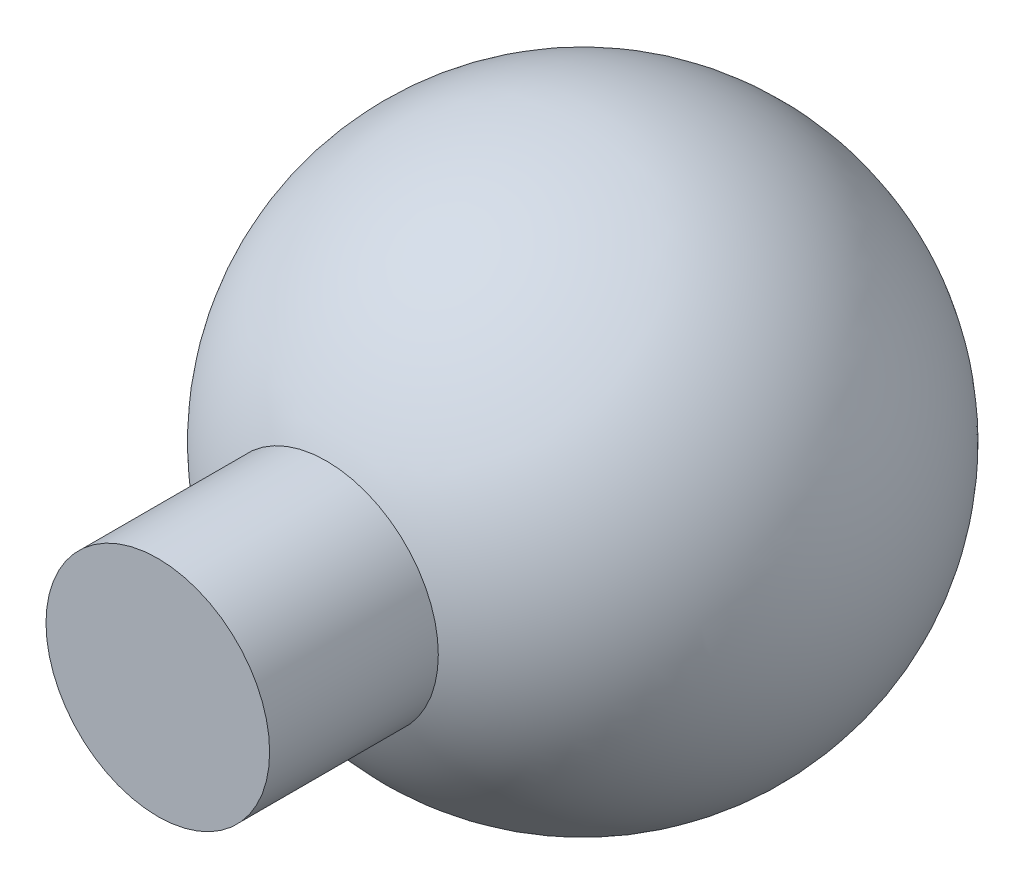
ISO-10303-21;
HEADER;
FILE_DESCRIPTION(('STEP AP214'),'2;1');
FILE_NAME('part.step','',(''),(''),'','','');
FILE_SCHEMA(('AUTOMOTIVE_DESIGN { 1 0 10303 214 1 1 1 1 }'));
ENDSEC;
DATA;
#1=APPLICATION_CONTEXT('core data for automotive mechanical design processes');
#2=APPLICATION_PROTOCOL_DEFINITION('international standard','automotive_design',2000,#1);
#3=PRODUCT_CONTEXT('',#1,'mechanical');
#4=PRODUCT('Part','Part','',(#3));
#5=PRODUCT_RELATED_PRODUCT_CATEGORY('part','',(#4));
#6=PRODUCT_DEFINITION_FORMATION('','',#4);
#7=PRODUCT_DEFINITION_CONTEXT('part definition',#1,'design');
#8=PRODUCT_DEFINITION('design','',#6,#7);
#9=PRODUCT_DEFINITION_SHAPE('','',#8);
#10=(LENGTH_UNIT() NAMED_UNIT(*) SI_UNIT(.MILLI.,.METRE.));
#11=(NAMED_UNIT(*) PLANE_ANGLE_UNIT() SI_UNIT($,.RADIAN.));
#12=(NAMED_UNIT(*) SI_UNIT($,.STERADIAN.) SOLID_ANGLE_UNIT());
#13=UNCERTAINTY_MEASURE_WITH_UNIT(LENGTH_MEASURE(1.E-05),#10,'distance_accuracy_value','');
#14=(GEOMETRIC_REPRESENTATION_CONTEXT(3) GLOBAL_UNCERTAINTY_ASSIGNED_CONTEXT((#13)) GLOBAL_UNIT_ASSIGNED_CONTEXT((#10,
#11,#12)) REPRESENTATION_CONTEXT('',''));
#15=CARTESIAN_POINT('',(0.,0.,0.));
#16=DIRECTION('',(0.,0.,1.));
#17=DIRECTION('',(1.,0.,0.));
#18=AXIS2_PLACEMENT_3D('',#15,#16,#17);
#19=CARTESIAN_POINT('',(0.,0.,0.));
#20=DIRECTION('',(0.,0.,1.));
#21=DIRECTION('',(1.,0.,0.));
#22=AXIS2_PLACEMENT_3D('',#19,#20,#21);
#23=PLANE('',#22);
#24=CARTESIAN_POINT('',(0.,0.,0.));
#25=DIRECTION('',(0.,0.,1.));
#26=DIRECTION('',(1.,0.,0.));
#27=AXIS2_PLACEMENT_3D('',#24,#25,#26);
#28=CIRCLE('',#27,10.);
#29=CARTESIAN_POINT('',(10.,0.,0.));
#30=VERTEX_POINT('',#29);
#31=EDGE_CURVE('E10',#30,#30,#28,.T.);
#32=ORIENTED_EDGE('',*,*,#31,.T.);
#33=EDGE_LOOP('',(#32));
#34=FACE_BOUND('',#33,.T.);
#35=ADVANCED_FACE('F36',(#34),#23,.T.);
#36=CARTESIAN_POINT('',(0.,0.,0.));
#37=DIRECTION('',(0.,0.,1.));
#38=DIRECTION('',(1.,0.,0.));
#39=AXIS2_PLACEMENT_3D('',#36,#37,#38);
#40=CYLINDRICAL_SURFACE('',#39,10.);
#41=CARTESIAN_POINT('',(0.,0.,-15.0871215252208));
#42=DIRECTION('',(0.,0.,1.));
#43=DIRECTION('',(1.,0.,0.));
#44=AXIS2_PLACEMENT_3D('',#41,#42,#43);
#45=CIRCLE('',#44,10.);
#46=CARTESIAN_POINT('',(10.,0.,-15.0871215252208));
#47=VERTEX_POINT('',#46);
#48=EDGE_CURVE('E42',#47,#47,#45,.T.);
#49=ORIENTED_EDGE('',*,*,#48,.T.);
#50=EDGE_LOOP('',(#49));
#51=FACE_BOUND('',#50,.T.);
#52=ORIENTED_EDGE('',*,*,#31,.F.);
#53=EDGE_LOOP('',(#52));
#54=FACE_BOUND('',#53,.T.);
#55=ADVANCED_FACE('F48',(#51,#54),#40,.T.);
#56=CARTESIAN_POINT('',(0.,0.,-38.));
#57=DIRECTION('',(0.,0.,1.));
#58=DIRECTION('',(1.,0.,0.));
#59=AXIS2_PLACEMENT_3D('',#56,#57,#58);
#60=SPHERICAL_SURFACE('',#59,25.);
#61=ORIENTED_EDGE('',*,*,#48,.F.);
#62=EDGE_LOOP('',(#61));
#63=FACE_BOUND('',#62,.T.);
#64=ADVANCED_FACE('F51',(#63),#60,.T.);
#65=CLOSED_SHELL('',(#35,#55,#64));
#66=MANIFOLD_SOLID_BREP('B2',#65);
#67=ADVANCED_BREP_SHAPE_REPRESENTATION('',(#18,#66),#14);
#68=SHAPE_DEFINITION_REPRESENTATION(#9,#67);
ENDSEC;
END-ISO-10303-21;
